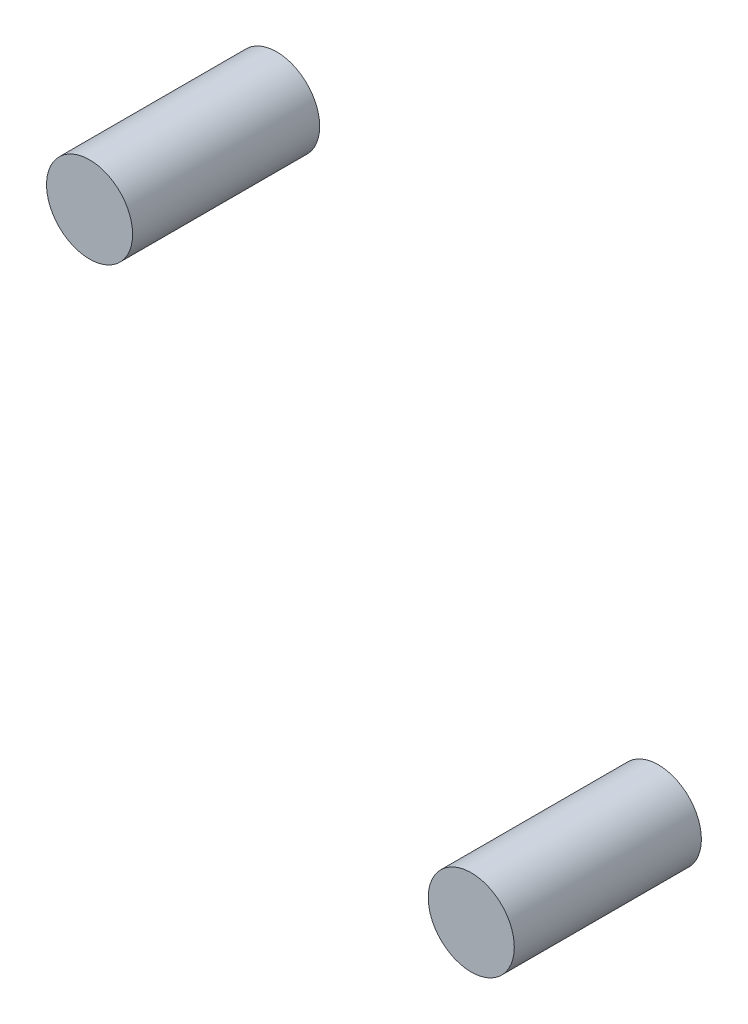
ISO-10303-21;
HEADER;
FILE_DESCRIPTION(('STEP AP214'),'2;1');
FILE_NAME('part.step','',(''),(''),'','','');
FILE_SCHEMA(('AUTOMOTIVE_DESIGN { 1 0 10303 214 1 1 1 1 }'));
ENDSEC;
DATA;
#1=APPLICATION_CONTEXT('core data for automotive mechanical design processes');
#2=APPLICATION_PROTOCOL_DEFINITION('international standard','automotive_design',2000,#1);
#3=PRODUCT_CONTEXT('',#1,'mechanical');
#4=PRODUCT('Part','Part','',(#3));
#5=PRODUCT_RELATED_PRODUCT_CATEGORY('part','',(#4));
#6=PRODUCT_DEFINITION_FORMATION('','',#4);
#7=PRODUCT_DEFINITION_CONTEXT('part definition',#1,'design');
#8=PRODUCT_DEFINITION('design','',#6,#7);
#9=PRODUCT_DEFINITION_SHAPE('','',#8);
#10=(LENGTH_UNIT() NAMED_UNIT(*) SI_UNIT(.MILLI.,.METRE.));
#11=(NAMED_UNIT(*) PLANE_ANGLE_UNIT() SI_UNIT($,.RADIAN.));
#12=(NAMED_UNIT(*) SI_UNIT($,.STERADIAN.) SOLID_ANGLE_UNIT());
#13=UNCERTAINTY_MEASURE_WITH_UNIT(LENGTH_MEASURE(1.E-05),#10,'distance_accuracy_value','');
#14=(GEOMETRIC_REPRESENTATION_CONTEXT(3) GLOBAL_UNCERTAINTY_ASSIGNED_CONTEXT((#13)) GLOBAL_UNIT_ASSIGNED_CONTEXT((#10,
#11,#12)) REPRESENTATION_CONTEXT('',''));
#15=CARTESIAN_POINT('',(0.,0.,0.));
#16=DIRECTION('',(0.,0.,1.));
#17=DIRECTION('',(1.,0.,0.));
#18=AXIS2_PLACEMENT_3D('',#15,#16,#17);
#19=CARTESIAN_POINT('',(67.4478150585404,-7.8309961141878,25.));
#20=DIRECTION('',(0.,0.,-1.));
#21=DIRECTION('',(-1.,0.,0.));
#22=AXIS2_PLACEMENT_3D('',#19,#20,#21);
#23=CYLINDRICAL_SURFACE('',#22,5.75);
#24=CARTESIAN_POINT('',(67.4478150585404,-7.8309961141878,25.));
#25=DIRECTION('',(0.,0.,1.));
#26=DIRECTION('',(1.,0.,0.));
#27=AXIS2_PLACEMENT_3D('',#24,#25,#26);
#28=CIRCLE('',#27,5.75);
#29=CARTESIAN_POINT('',(73.1978150585405,-7.8309961141878,25.));
#30=VERTEX_POINT('',#29);
#31=EDGE_CURVE('E11',#30,#30,#28,.T.);
#32=ORIENTED_EDGE('',*,*,#31,.F.);
#33=EDGE_LOOP('',(#32));
#34=FACE_BOUND('',#33,.T.);
#35=CARTESIAN_POINT('',(67.4478150585404,-7.8309961141878,0.));
#36=DIRECTION('',(0.,0.,1.));
#37=DIRECTION('',(1.,0.,0.));
#38=AXIS2_PLACEMENT_3D('',#35,#36,#37);
#39=CIRCLE('',#38,5.75);
#40=CARTESIAN_POINT('',(73.1978150585405,-7.8309961141878,0.));
#41=VERTEX_POINT('',#40);
#42=EDGE_CURVE('E43',#41,#41,#39,.T.);
#43=ORIENTED_EDGE('',*,*,#42,.T.);
#44=EDGE_LOOP('',(#43));
#45=FACE_BOUND('',#44,.T.);
#46=ADVANCED_FACE('F40',(#34,#45),#23,.T.);
#47=CARTESIAN_POINT('',(67.4478150585404,-7.8309961141878,25.));
#48=DIRECTION('',(0.,0.,1.));
#49=DIRECTION('',(1.,0.,0.));
#50=AXIS2_PLACEMENT_3D('',#47,#48,#49);
#51=PLANE('',#50);
#52=ORIENTED_EDGE('',*,*,#31,.T.);
#53=EDGE_LOOP('',(#52));
#54=FACE_BOUND('',#53,.T.);
#55=ADVANCED_FACE('F55',(#54),#51,.T.);
#56=CARTESIAN_POINT('',(67.4478150585404,-7.8309961141878,0.));
#57=DIRECTION('',(0.,0.,1.));
#58=DIRECTION('',(1.,0.,0.));
#59=AXIS2_PLACEMENT_3D('',#56,#57,#58);
#60=PLANE('',#59);
#61=ORIENTED_EDGE('',*,*,#42,.F.);
#62=EDGE_LOOP('',(#61));
#63=FACE_BOUND('',#62,.T.);
#64=ADVANCED_FACE('F53',(#63),#60,.F.);
#65=CLOSED_SHELL('',(#46,#55,#64));
#66=MANIFOLD_SOLID_BREP('B2',#65);
#67=CARTESIAN_POINT('',(16.4478150585404,49.1690038858122,25.));
#68=DIRECTION('',(0.,0.,-1.));
#69=DIRECTION('',(-1.,0.,0.));
#70=AXIS2_PLACEMENT_3D('',#67,#68,#69);
#71=CYLINDRICAL_SURFACE('',#70,5.75);
#72=CARTESIAN_POINT('',(16.4478150585404,49.1690038858122,25.));
#73=DIRECTION('',(0.,0.,1.));
#74=DIRECTION('',(1.,0.,0.));
#75=AXIS2_PLACEMENT_3D('',#72,#73,#74);
#76=CIRCLE('',#75,5.75);
#77=CARTESIAN_POINT('',(22.1978150585404,49.1690038858122,25.));
#78=VERTEX_POINT('',#77);
#79=EDGE_CURVE('E39',#78,#78,#76,.T.);
#80=ORIENTED_EDGE('',*,*,#79,.F.);
#81=EDGE_LOOP('',(#80));
#82=FACE_BOUND('',#81,.T.);
#83=CARTESIAN_POINT('',(16.4478150585404,49.1690038858122,0.));
#84=DIRECTION('',(0.,0.,1.));
#85=DIRECTION('',(1.,0.,0.));
#86=AXIS2_PLACEMENT_3D('',#83,#84,#85);
#87=CIRCLE('',#86,5.75);
#88=CARTESIAN_POINT('',(22.1978150585404,49.1690038858122,0.));
#89=VERTEX_POINT('',#88);
#90=EDGE_CURVE('E83',#89,#89,#87,.T.);
#91=ORIENTED_EDGE('',*,*,#90,.T.);
#92=EDGE_LOOP('',(#91));
#93=FACE_BOUND('',#92,.T.);
#94=ADVANCED_FACE('F80',(#82,#93),#71,.T.);
#95=CARTESIAN_POINT('',(16.4478150585404,49.1690038858122,25.));
#96=DIRECTION('',(0.,0.,1.));
#97=DIRECTION('',(1.,0.,0.));
#98=AXIS2_PLACEMENT_3D('',#95,#96,#97);
#99=PLANE('',#98);
#100=ORIENTED_EDGE('',*,*,#79,.T.);
#101=EDGE_LOOP('',(#100));
#102=FACE_BOUND('',#101,.T.);
#103=ADVANCED_FACE('F95',(#102),#99,.T.);
#104=CARTESIAN_POINT('',(16.4478150585404,49.1690038858122,0.));
#105=DIRECTION('',(0.,0.,1.));
#106=DIRECTION('',(1.,0.,0.));
#107=AXIS2_PLACEMENT_3D('',#104,#105,#106);
#108=PLANE('',#107);
#109=ORIENTED_EDGE('',*,*,#90,.F.);
#110=EDGE_LOOP('',(#109));
#111=FACE_BOUND('',#110,.T.);
#112=ADVANCED_FACE('F93',(#111),#108,.F.);
#113=CLOSED_SHELL('',(#94,#103,#112));
#114=MANIFOLD_SOLID_BREP('B6',#113);
#115=ADVANCED_BREP_SHAPE_REPRESENTATION('',(#18,#66,#114),#14);
#116=SHAPE_DEFINITION_REPRESENTATION(#9,#115);
ENDSEC;
END-ISO-10303-21;
